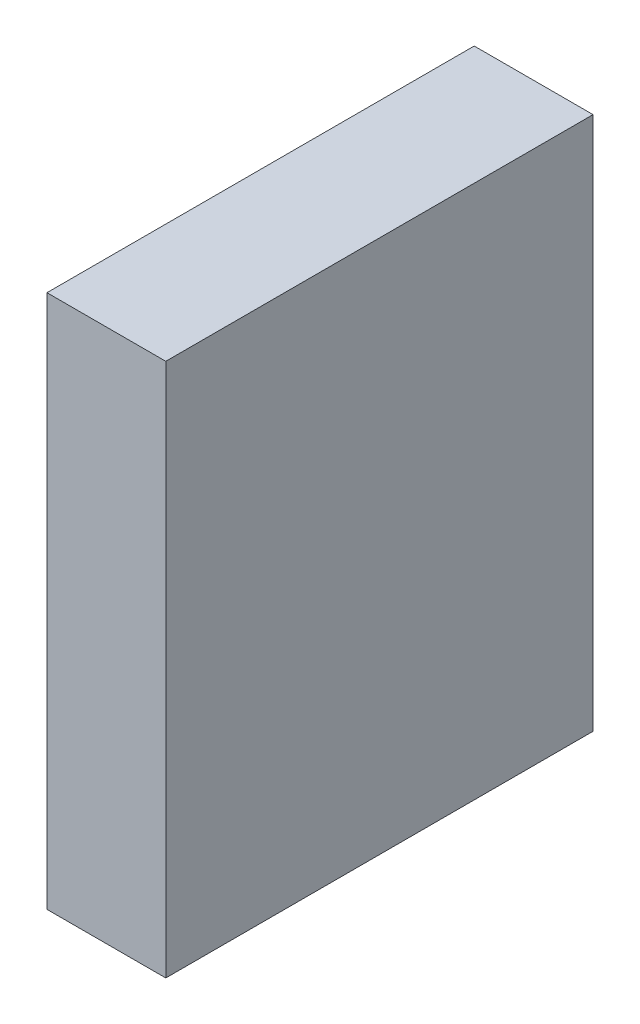
ISO-10303-21;
HEADER;
FILE_DESCRIPTION(('STEP AP214'),'2;1');
FILE_NAME('part.step','',(''),(''),'','','');
FILE_SCHEMA(('AUTOMOTIVE_DESIGN { 1 0 10303 214 1 1 1 1 }'));
ENDSEC;
DATA;
#1=APPLICATION_CONTEXT('core data for automotive mechanical design processes');
#2=APPLICATION_PROTOCOL_DEFINITION('international standard','automotive_design',2000,#1);
#3=PRODUCT_CONTEXT('',#1,'mechanical');
#4=PRODUCT('Part','Part','',(#3));
#5=PRODUCT_RELATED_PRODUCT_CATEGORY('part','',(#4));
#6=PRODUCT_DEFINITION_FORMATION('','',#4);
#7=PRODUCT_DEFINITION_CONTEXT('part definition',#1,'design');
#8=PRODUCT_DEFINITION('design','',#6,#7);
#9=PRODUCT_DEFINITION_SHAPE('','',#8);
#10=(LENGTH_UNIT() NAMED_UNIT(*) SI_UNIT(.MILLI.,.METRE.));
#11=(NAMED_UNIT(*) PLANE_ANGLE_UNIT() SI_UNIT($,.RADIAN.));
#12=(NAMED_UNIT(*) SI_UNIT($,.STERADIAN.) SOLID_ANGLE_UNIT());
#13=UNCERTAINTY_MEASURE_WITH_UNIT(LENGTH_MEASURE(1.E-05),#10,'distance_accuracy_value','');
#14=(GEOMETRIC_REPRESENTATION_CONTEXT(3) GLOBAL_UNCERTAINTY_ASSIGNED_CONTEXT((#13)) GLOBAL_UNIT_ASSIGNED_CONTEXT((#10,
#11,#12)) REPRESENTATION_CONTEXT('',''));
#15=CARTESIAN_POINT('',(0.,0.,0.));
#16=DIRECTION('',(0.,0.,1.));
#17=DIRECTION('',(1.,0.,0.));
#18=AXIS2_PLACEMENT_3D('',#15,#16,#17);
#19=CARTESIAN_POINT('',(-22.25,41.7052322815721,51.9208316817145));
#20=DIRECTION('',(0.,0.,1.));
#21=DIRECTION('',(0.,-1.,0.));
#22=AXIS2_PLACEMENT_3D('',#19,#20,#21);
#23=PLANE('',#22);
#24=DIRECTION('',(0.,-1.,0.));
#25=VECTOR('',#24,1.);
#26=CARTESIAN_POINT('',(0.,41.7052322815721,51.9208316817145));
#27=LINE('',#26,#25);
#28=CARTESIAN_POINT('',(0.,41.7052322815721,51.9208316817145));
#29=VERTEX_POINT('',#28);
#30=CARTESIAN_POINT('',(0.,-58.2947677184279,51.9208316817145));
#31=VERTEX_POINT('',#30);
#32=EDGE_CURVE('E97',#29,#31,#27,.T.);
#33=ORIENTED_EDGE('',*,*,#32,.F.);
#34=DIRECTION('',(1.,0.,0.));
#35=VECTOR('',#34,1.);
#36=CARTESIAN_POINT('',(-22.25,41.7052322815721,51.9208316817145));
#37=LINE('',#36,#35);
#38=CARTESIAN_POINT('',(-22.25,41.7052322815721,51.9208316817145));
#39=VERTEX_POINT('',#38);
#40=EDGE_CURVE('E11',#39,#29,#37,.T.);
#41=ORIENTED_EDGE('',*,*,#40,.F.);
#42=DIRECTION('',(0.,-1.,0.));
#43=VECTOR('',#42,1.);
#44=CARTESIAN_POINT('',(-22.25,41.7052322815721,51.9208316817145));
#45=LINE('',#44,#43);
#46=CARTESIAN_POINT('',(-22.25,-58.2947677184279,51.9208316817145));
#47=VERTEX_POINT('',#46);
#48=EDGE_CURVE('E91',#39,#47,#45,.T.);
#49=ORIENTED_EDGE('',*,*,#48,.T.);
#50=DIRECTION('',(1.,0.,0.));
#51=VECTOR('',#50,1.);
#52=CARTESIAN_POINT('',(-22.25,-58.2947677184279,51.9208316817145));
#53=LINE('',#52,#51);
#54=EDGE_CURVE('E36',#47,#31,#53,.T.);
#55=ORIENTED_EDGE('',*,*,#54,.T.);
#56=EDGE_LOOP('',(#33,#41,#49,#55));
#57=FACE_BOUND('',#56,.T.);
#58=ADVANCED_FACE('F33',(#57),#23,.T.);
#59=CARTESIAN_POINT('',(-22.25,41.7052322815721,51.9208316817145));
#60=DIRECTION('',(0.,1.,0.));
#61=DIRECTION('',(0.,0.,1.));
#62=AXIS2_PLACEMENT_3D('',#59,#60,#61);
#63=PLANE('',#62);
#64=DIRECTION('',(0.,0.,1.));
#65=VECTOR('',#64,1.);
#66=CARTESIAN_POINT('',(0.,41.7052322815721,51.9208316817145));
#67=LINE('',#66,#65);
#68=CARTESIAN_POINT('',(0.,41.7052322815721,-28.0791683182855));
#69=VERTEX_POINT('',#68);
#70=EDGE_CURVE('E93',#69,#29,#67,.T.);
#71=ORIENTED_EDGE('',*,*,#70,.F.);
#72=DIRECTION('',(1.,0.,0.));
#73=VECTOR('',#72,1.);
#74=CARTESIAN_POINT('',(-22.25,41.7052322815721,-28.0791683182855));
#75=LINE('',#74,#73);
#76=CARTESIAN_POINT('',(-22.25,41.7052322815721,-28.0791683182855));
#77=VERTEX_POINT('',#76);
#78=EDGE_CURVE('E42',#77,#69,#75,.T.);
#79=ORIENTED_EDGE('',*,*,#78,.F.);
#80=DIRECTION('',(0.,0.,1.));
#81=VECTOR('',#80,1.);
#82=CARTESIAN_POINT('',(-22.25,41.7052322815721,51.9208316817145));
#83=LINE('',#82,#81);
#84=EDGE_CURVE('E88',#77,#39,#83,.T.);
#85=ORIENTED_EDGE('',*,*,#84,.T.);
#86=ORIENTED_EDGE('',*,*,#40,.T.);
#87=EDGE_LOOP('',(#71,#79,#85,#86));
#88=FACE_BOUND('',#87,.T.);
#89=ADVANCED_FACE('F107',(#88),#63,.T.);
#90=CARTESIAN_POINT('',(-22.25,41.7052322815721,-28.0791683182855));
#91=DIRECTION('',(0.,0.,-1.));
#92=DIRECTION('',(0.,1.,0.));
#93=AXIS2_PLACEMENT_3D('',#90,#91,#92);
#94=PLANE('',#93);
#95=DIRECTION('',(0.,1.,0.));
#96=VECTOR('',#95,1.);
#97=CARTESIAN_POINT('',(0.,41.7052322815721,-28.0791683182855));
#98=LINE('',#97,#96);
#99=CARTESIAN_POINT('',(0.,-58.2947677184279,-28.0791683182855));
#100=VERTEX_POINT('',#99);
#101=EDGE_CURVE('E83',#100,#69,#98,.T.);
#102=ORIENTED_EDGE('',*,*,#101,.F.);
#103=DIRECTION('',(1.,0.,0.));
#104=VECTOR('',#103,1.);
#105=CARTESIAN_POINT('',(-22.25,-58.2947677184279,-28.0791683182855));
#106=LINE('',#105,#104);
#107=CARTESIAN_POINT('',(-22.25,-58.2947677184279,-28.0791683182855));
#108=VERTEX_POINT('',#107);
#109=EDGE_CURVE('E78',#108,#100,#106,.T.);
#110=ORIENTED_EDGE('',*,*,#109,.F.);
#111=DIRECTION('',(0.,1.,0.));
#112=VECTOR('',#111,1.);
#113=CARTESIAN_POINT('',(-22.25,41.7052322815721,-28.0791683182855));
#114=LINE('',#113,#112);
#115=EDGE_CURVE('E81',#108,#77,#114,.T.);
#116=ORIENTED_EDGE('',*,*,#115,.T.);
#117=ORIENTED_EDGE('',*,*,#78,.T.);
#118=EDGE_LOOP('',(#102,#110,#116,#117));
#119=FACE_BOUND('',#118,.T.);
#120=ADVANCED_FACE('F80',(#119),#94,.T.);
#121=CARTESIAN_POINT('',(-22.25,-58.2947677184279,51.9208316817145));
#122=DIRECTION('',(0.,-1.,0.));
#123=DIRECTION('',(0.,0.,-1.));
#124=AXIS2_PLACEMENT_3D('',#121,#122,#123);
#125=PLANE('',#124);
#126=DIRECTION('',(0.,0.,-1.));
#127=VECTOR('',#126,1.);
#128=CARTESIAN_POINT('',(0.,-58.2947677184279,51.9208316817145));
#129=LINE('',#128,#127);
#130=EDGE_CURVE('E100',#31,#100,#129,.T.);
#131=ORIENTED_EDGE('',*,*,#130,.F.);
#132=ORIENTED_EDGE('',*,*,#54,.F.);
#133=DIRECTION('',(0.,0.,-1.));
#134=VECTOR('',#133,1.);
#135=CARTESIAN_POINT('',(-22.25,-58.2947677184279,51.9208316817145));
#136=LINE('',#135,#134);
#137=EDGE_CURVE('E87',#47,#108,#136,.T.);
#138=ORIENTED_EDGE('',*,*,#137,.T.);
#139=ORIENTED_EDGE('',*,*,#109,.T.);
#140=EDGE_LOOP('',(#131,#132,#138,#139));
#141=FACE_BOUND('',#140,.T.);
#142=ADVANCED_FACE('F90',(#141),#125,.T.);
#143=CARTESIAN_POINT('',(-22.25,0.,0.));
#144=DIRECTION('',(1.,0.,0.));
#145=DIRECTION('',(0.,0.,-1.));
#146=AXIS2_PLACEMENT_3D('',#143,#144,#145);
#147=PLANE('',#146);
#148=ORIENTED_EDGE('',*,*,#48,.F.);
#149=ORIENTED_EDGE('',*,*,#84,.F.);
#150=ORIENTED_EDGE('',*,*,#115,.F.);
#151=ORIENTED_EDGE('',*,*,#137,.F.);
#152=EDGE_LOOP('',(#148,#149,#150,#151));
#153=FACE_BOUND('',#152,.T.);
#154=ADVANCED_FACE('F86',(#153),#147,.F.);
#155=CARTESIAN_POINT('',(0.,0.,0.));
#156=DIRECTION('',(1.,0.,0.));
#157=DIRECTION('',(0.,0.,-1.));
#158=AXIS2_PLACEMENT_3D('',#155,#156,#157);
#159=PLANE('',#158);
#160=ORIENTED_EDGE('',*,*,#32,.T.);
#161=ORIENTED_EDGE('',*,*,#130,.T.);
#162=ORIENTED_EDGE('',*,*,#101,.T.);
#163=ORIENTED_EDGE('',*,*,#70,.T.);
#164=EDGE_LOOP('',(#160,#161,#162,#163));
#165=FACE_BOUND('',#164,.T.);
#166=ADVANCED_FACE('F106',(#165),#159,.T.);
#167=CLOSED_SHELL('',(#58,#89,#120,#142,#154,#166));
#168=MANIFOLD_SOLID_BREP('B2',#167);
#169=ADVANCED_BREP_SHAPE_REPRESENTATION('',(#18,#168),#14);
#170=SHAPE_DEFINITION_REPRESENTATION(#9,#169);
ENDSEC;
END-ISO-10303-21;
